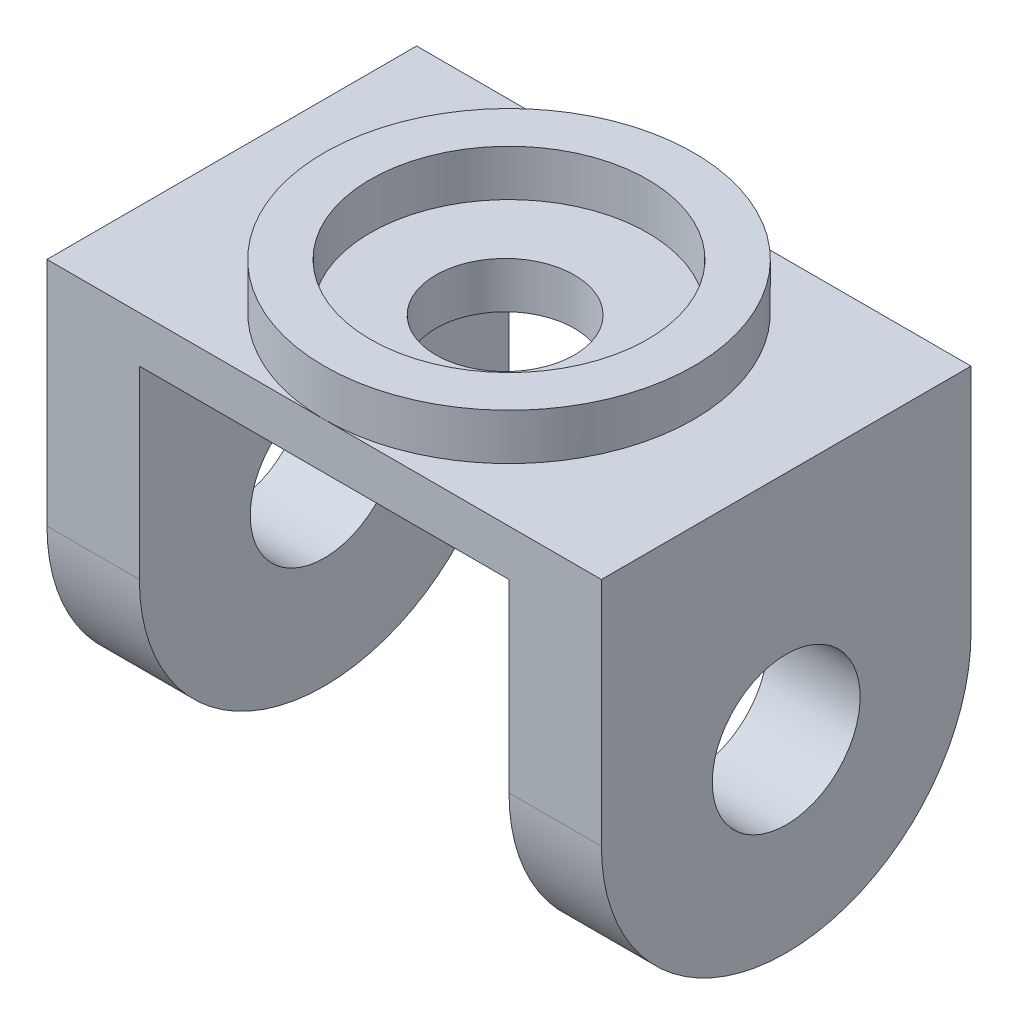
ISO-10303-21;
HEADER;
FILE_DESCRIPTION(('STEP AP214'),'2;1');
FILE_NAME('part.step','',(''),(''),'','','');
FILE_SCHEMA(('AUTOMOTIVE_DESIGN { 1 0 10303 214 1 1 1 1 }'));
ENDSEC;
DATA;
#1=APPLICATION_CONTEXT('core data for automotive mechanical design processes');
#2=APPLICATION_PROTOCOL_DEFINITION('international standard','automotive_design',2000,#1);
#3=PRODUCT_CONTEXT('',#1,'mechanical');
#4=PRODUCT('Part','Part','',(#3));
#5=PRODUCT_RELATED_PRODUCT_CATEGORY('part','',(#4));
#6=PRODUCT_DEFINITION_FORMATION('','',#4);
#7=PRODUCT_DEFINITION_CONTEXT('part definition',#1,'design');
#8=PRODUCT_DEFINITION('design','',#6,#7);
#9=PRODUCT_DEFINITION_SHAPE('','',#8);
#10=(LENGTH_UNIT() NAMED_UNIT(*) SI_UNIT(.MILLI.,.METRE.));
#11=(NAMED_UNIT(*) PLANE_ANGLE_UNIT() SI_UNIT($,.RADIAN.));
#12=(NAMED_UNIT(*) SI_UNIT($,.STERADIAN.) SOLID_ANGLE_UNIT());
#13=UNCERTAINTY_MEASURE_WITH_UNIT(LENGTH_MEASURE(1.E-05),#10,'distance_accuracy_value','');
#14=(GEOMETRIC_REPRESENTATION_CONTEXT(3) GLOBAL_UNCERTAINTY_ASSIGNED_CONTEXT((#13)) GLOBAL_UNIT_ASSIGNED_CONTEXT((#10,
#11,#12)) REPRESENTATION_CONTEXT('',''));
#15=CARTESIAN_POINT('',(0.,0.,0.));
#16=DIRECTION('',(0.,0.,1.));
#17=DIRECTION('',(1.,0.,0.));
#18=AXIS2_PLACEMENT_3D('',#15,#16,#17);
#19=CARTESIAN_POINT('',(60.,-40.,0.));
#20=DIRECTION('',(-1.,0.,0.));
#21=DIRECTION('',(0.,0.,1.));
#22=AXIS2_PLACEMENT_3D('',#19,#20,#21);
#23=CYLINDRICAL_SURFACE('',#22,40.);
#24=DIRECTION('',(1.,0.,0.));
#25=VECTOR('',#24,1.);
#26=CARTESIAN_POINT('',(60.,-40.,-40.));
#27=LINE('',#26,#25);
#28=CARTESIAN_POINT('',(60.,-40.,-40.));
#29=VERTEX_POINT('',#28);
#30=CARTESIAN_POINT('',(40.,-40.,-40.));
#31=VERTEX_POINT('',#30);
#32=EDGE_CURVE('E187',#29,#31,#27,.F.);
#33=ORIENTED_EDGE('',*,*,#32,.F.);
#34=CARTESIAN_POINT('',(60.,-40.,0.));
#35=DIRECTION('',(-1.,0.,0.));
#36=DIRECTION('',(0.,0.,1.));
#37=AXIS2_PLACEMENT_3D('',#34,#35,#36);
#38=CIRCLE('',#37,40.);
#39=CARTESIAN_POINT('',(60.,-40.,40.));
#40=VERTEX_POINT('',#39);
#41=EDGE_CURVE('E55',#40,#29,#38,.F.);
#42=ORIENTED_EDGE('',*,*,#41,.F.);
#43=DIRECTION('',(1.,0.,0.));
#44=VECTOR('',#43,1.);
#45=CARTESIAN_POINT('',(60.,-40.,40.));
#46=LINE('',#45,#44);
#47=CARTESIAN_POINT('',(40.,-40.,40.));
#48=VERTEX_POINT('',#47);
#49=EDGE_CURVE('E196',#48,#40,#46,.T.);
#50=ORIENTED_EDGE('',*,*,#49,.F.);
#51=CARTESIAN_POINT('',(40.,-40.,0.));
#52=DIRECTION('',(-1.,0.,0.));
#53=DIRECTION('',(0.,0.,1.));
#54=AXIS2_PLACEMENT_3D('',#51,#52,#53);
#55=CIRCLE('',#54,40.);
#56=EDGE_CURVE('E11',#31,#48,#55,.T.);
#57=ORIENTED_EDGE('',*,*,#56,.F.);
#58=EDGE_LOOP('',(#33,#42,#50,#57));
#59=FACE_BOUND('',#58,.T.);
#60=ADVANCED_FACE('F45',(#59),#23,.T.);
#61=CARTESIAN_POINT('',(-40.,-40.,0.));
#62=DIRECTION('',(1.,0.,0.));
#63=DIRECTION('',(0.,0.,-1.));
#64=AXIS2_PLACEMENT_3D('',#61,#62,#63);
#65=CYLINDRICAL_SURFACE('',#64,40.);
#66=DIRECTION('',(-1.,0.,0.));
#67=VECTOR('',#66,1.);
#68=CARTESIAN_POINT('',(-40.,-40.,-40.));
#69=LINE('',#68,#67);
#70=CARTESIAN_POINT('',(-40.,-40.,-40.));
#71=VERTEX_POINT('',#70);
#72=CARTESIAN_POINT('',(-60.,-40.,-40.));
#73=VERTEX_POINT('',#72);
#74=EDGE_CURVE('E174',#71,#73,#69,.T.);
#75=ORIENTED_EDGE('',*,*,#74,.F.);
#76=CARTESIAN_POINT('',(-40.,-40.,0.));
#77=DIRECTION('',(-1.,0.,0.));
#78=DIRECTION('',(0.,0.,1.));
#79=AXIS2_PLACEMENT_3D('',#76,#77,#78);
#80=CIRCLE('',#79,40.);
#81=CARTESIAN_POINT('',(-40.,-40.,40.));
#82=VERTEX_POINT('',#81);
#83=EDGE_CURVE('E181',#82,#71,#80,.F.);
#84=ORIENTED_EDGE('',*,*,#83,.F.);
#85=DIRECTION('',(-1.,0.,0.));
#86=VECTOR('',#85,1.);
#87=CARTESIAN_POINT('',(-40.,-40.,40.));
#88=LINE('',#87,#86);
#89=CARTESIAN_POINT('',(-60.,-40.,40.));
#90=VERTEX_POINT('',#89);
#91=EDGE_CURVE('E178',#90,#82,#88,.F.);
#92=ORIENTED_EDGE('',*,*,#91,.F.);
#93=CARTESIAN_POINT('',(-60.,-40.,0.));
#94=DIRECTION('',(1.,0.,0.));
#95=DIRECTION('',(0.,0.,-1.));
#96=AXIS2_PLACEMENT_3D('',#93,#94,#95);
#97=CIRCLE('',#96,40.);
#98=EDGE_CURVE('E184',#73,#90,#97,.F.);
#99=ORIENTED_EDGE('',*,*,#98,.F.);
#100=EDGE_LOOP('',(#75,#84,#92,#99));
#101=FACE_BOUND('',#100,.T.);
#102=ADVANCED_FACE('F275',(#101),#65,.T.);
#103=CARTESIAN_POINT('',(0.,0.,0.));
#104=DIRECTION('',(0.,1.,0.));
#105=DIRECTION('',(0.,0.,1.));
#106=AXIS2_PLACEMENT_3D('',#103,#104,#105);
#107=PLANE('',#106);
#108=CARTESIAN_POINT('',(0.,0.,0.840544131092552));
#109=DIRECTION('',(0.,1.,0.));
#110=DIRECTION('',(0.,0.,1.));
#111=AXIS2_PLACEMENT_3D('',#108,#109,#110);
#112=CIRCLE('',#111,15.);
#113=CARTESIAN_POINT('',(0.,0.,15.8405441310926));
#114=VERTEX_POINT('',#113);
#115=EDGE_CURVE('E168',#114,#114,#112,.T.);
#116=ORIENTED_EDGE('',*,*,#115,.T.);
#117=EDGE_LOOP('',(#116));
#118=FACE_BOUND('',#117,.T.);
#119=DIRECTION('',(-1.,0.,0.));
#120=VECTOR('',#119,1.);
#121=CARTESIAN_POINT('',(-60.,0.,-40.));
#122=LINE('',#121,#120);
#123=CARTESIAN_POINT('',(40.,0.,-40.));
#124=VERTEX_POINT('',#123);
#125=CARTESIAN_POINT('',(-40.,0.,-40.));
#126=VERTEX_POINT('',#125);
#127=EDGE_CURVE('E131',#124,#126,#122,.T.);
#128=ORIENTED_EDGE('',*,*,#127,.F.);
#129=DIRECTION('',(0.,0.,1.));
#130=VECTOR('',#129,1.);
#131=CARTESIAN_POINT('',(40.,0.,40.));
#132=LINE('',#131,#130);
#133=CARTESIAN_POINT('',(40.,0.,40.));
#134=VERTEX_POINT('',#133);
#135=EDGE_CURVE('E117',#124,#134,#132,.T.);
#136=ORIENTED_EDGE('',*,*,#135,.T.);
#137=DIRECTION('',(1.,0.,0.));
#138=VECTOR('',#137,1.);
#139=CARTESIAN_POINT('',(-60.,0.,40.));
#140=LINE('',#139,#138);
#141=CARTESIAN_POINT('',(-40.,0.,40.));
#142=VERTEX_POINT('',#141);
#143=EDGE_CURVE('E129',#142,#134,#140,.T.);
#144=ORIENTED_EDGE('',*,*,#143,.F.);
#145=DIRECTION('',(0.,0.,1.));
#146=VECTOR('',#145,1.);
#147=CARTESIAN_POINT('',(-40.,0.,40.));
#148=LINE('',#147,#146);
#149=EDGE_CURVE('E192',#126,#142,#148,.T.);
#150=ORIENTED_EDGE('',*,*,#149,.F.);
#151=EDGE_LOOP('',(#128,#136,#144,#150));
#152=FACE_BOUND('',#151,.T.);
#153=ADVANCED_FACE('F127',(#118,#152),#107,.F.);
#154=CARTESIAN_POINT('',(0.,10.,0.));
#155=DIRECTION('',(0.,1.,0.));
#156=DIRECTION('',(0.,0.,1.));
#157=AXIS2_PLACEMENT_3D('',#154,#155,#156);
#158=PLANE('',#157);
#159=DIRECTION('',(1.,0.,0.));
#160=VECTOR('',#159,1.);
#161=CARTESIAN_POINT('',(-60.,10.,40.));
#162=LINE('',#161,#160);
#163=CARTESIAN_POINT('',(-60.,10.,40.));
#164=VERTEX_POINT('',#163);
#165=CARTESIAN_POINT('',(0.,10.,40.));
#166=VERTEX_POINT('',#165);
#167=EDGE_CURVE('E155',#164,#166,#162,.T.);
#168=ORIENTED_EDGE('',*,*,#167,.T.);
#169=CARTESIAN_POINT('',(0.,10.,0.));
#170=DIRECTION('',(0.,1.,0.));
#171=DIRECTION('',(0.,0.,1.));
#172=AXIS2_PLACEMENT_3D('',#169,#170,#171);
#173=CIRCLE('',#172,40.);
#174=CARTESIAN_POINT('',(0.,10.,-40.));
#175=VERTEX_POINT('',#174);
#176=EDGE_CURVE('E146',#166,#175,#173,.F.);
#177=ORIENTED_EDGE('',*,*,#176,.T.);
#178=DIRECTION('',(-1.,0.,0.));
#179=VECTOR('',#178,1.);
#180=CARTESIAN_POINT('',(-60.,10.,-40.));
#181=LINE('',#180,#179);
#182=CARTESIAN_POINT('',(-60.,10.,-40.));
#183=VERTEX_POINT('',#182);
#184=EDGE_CURVE('E144',#175,#183,#181,.T.);
#185=ORIENTED_EDGE('',*,*,#184,.T.);
#186=DIRECTION('',(0.,0.,1.));
#187=VECTOR('',#186,1.);
#188=CARTESIAN_POINT('',(-60.,10.,-40.));
#189=LINE('',#188,#187);
#190=EDGE_CURVE('E214',#183,#164,#189,.T.);
#191=ORIENTED_EDGE('',*,*,#190,.T.);
#192=EDGE_LOOP('',(#168,#177,#185,#191));
#193=FACE_BOUND('',#192,.T.);
#194=ADVANCED_FACE('F283',(#193),#158,.T.);
#195=CARTESIAN_POINT('',(60.,10.,-40.));
#196=DIRECTION('',(-1.,0.,0.));
#197=DIRECTION('',(0.,0.,1.));
#198=AXIS2_PLACEMENT_3D('',#195,#196,#197);
#199=PLANE('',#198);
#200=CARTESIAN_POINT('',(60.,-40.,0.));
#201=DIRECTION('',(-1.,0.,0.));
#202=DIRECTION('',(0.,0.,1.));
#203=AXIS2_PLACEMENT_3D('',#200,#201,#202);
#204=CIRCLE('',#203,16.);
#205=CARTESIAN_POINT('',(60.,-40.,16.));
#206=VERTEX_POINT('',#205);
#207=EDGE_CURVE('E255',#206,#206,#204,.T.);
#208=ORIENTED_EDGE('',*,*,#207,.T.);
#209=EDGE_LOOP('',(#208));
#210=FACE_BOUND('',#209,.T.);
#211=DIRECTION('',(0.,-1.,0.));
#212=VECTOR('',#211,1.);
#213=CARTESIAN_POINT('',(60.,10.,40.));
#214=LINE('',#213,#212);
#215=CARTESIAN_POINT('',(60.,10.,40.));
#216=VERTEX_POINT('',#215);
#217=EDGE_CURVE('E150',#216,#40,#214,.T.);
#218=ORIENTED_EDGE('',*,*,#217,.T.);
#219=ORIENTED_EDGE('',*,*,#41,.T.);
#220=DIRECTION('',(0.,-1.,0.));
#221=VECTOR('',#220,1.);
#222=CARTESIAN_POINT('',(60.,10.,-40.));
#223=LINE('',#222,#221);
#224=CARTESIAN_POINT('',(60.,10.,-40.));
#225=VERTEX_POINT('',#224);
#226=EDGE_CURVE('E163',#225,#29,#223,.T.);
#227=ORIENTED_EDGE('',*,*,#226,.F.);
#228=DIRECTION('',(0.,0.,-1.));
#229=VECTOR('',#228,1.);
#230=CARTESIAN_POINT('',(60.,10.,-40.));
#231=LINE('',#230,#229);
#232=EDGE_CURVE('E139',#216,#225,#231,.T.);
#233=ORIENTED_EDGE('',*,*,#232,.F.);
#234=EDGE_LOOP('',(#218,#219,#227,#233));
#235=FACE_BOUND('',#234,.T.);
#236=ADVANCED_FACE('F202',(#210,#235),#199,.F.);
#237=CARTESIAN_POINT('',(-60.,10.,-40.));
#238=DIRECTION('',(0.,0.,1.));
#239=DIRECTION('',(1.,0.,0.));
#240=AXIS2_PLACEMENT_3D('',#237,#238,#239);
#241=PLANE('',#240);
#242=ORIENTED_EDGE('',*,*,#226,.T.);
#243=ORIENTED_EDGE('',*,*,#32,.T.);
#244=DIRECTION('',(0.,1.,0.));
#245=VECTOR('',#244,1.);
#246=CARTESIAN_POINT('',(40.,-80.,-40.));
#247=LINE('',#246,#245);
#248=EDGE_CURVE('E123',#31,#124,#247,.T.);
#249=ORIENTED_EDGE('',*,*,#248,.T.);
#250=ORIENTED_EDGE('',*,*,#127,.T.);
#251=DIRECTION('',(0.,1.,0.));
#252=VECTOR('',#251,1.);
#253=CARTESIAN_POINT('',(-40.,-80.,-40.));
#254=LINE('',#253,#252);
#255=EDGE_CURVE('E242',#71,#126,#254,.T.);
#256=ORIENTED_EDGE('',*,*,#255,.F.);
#257=ORIENTED_EDGE('',*,*,#74,.T.);
#258=DIRECTION('',(0.,-1.,0.));
#259=VECTOR('',#258,1.);
#260=CARTESIAN_POINT('',(-60.,10.,-40.));
#261=LINE('',#260,#259);
#262=EDGE_CURVE('E159',#183,#73,#261,.T.);
#263=ORIENTED_EDGE('',*,*,#262,.F.);
#264=ORIENTED_EDGE('',*,*,#184,.F.);
#265=EDGE_CURVE('E209',#225,#175,#181,.T.);
#266=ORIENTED_EDGE('',*,*,#265,.F.);
#267=EDGE_LOOP('',(#242,#243,#249,#250,#256,#257,#263,#264,#266));
#268=FACE_BOUND('',#267,.T.);
#269=ADVANCED_FACE('F206',(#268),#241,.F.);
#270=CARTESIAN_POINT('',(-60.,10.,-40.));
#271=DIRECTION('',(1.,0.,0.));
#272=DIRECTION('',(0.,0.,-1.));
#273=AXIS2_PLACEMENT_3D('',#270,#271,#272);
#274=PLANE('',#273);
#275=CARTESIAN_POINT('',(-60.,-40.,0.));
#276=DIRECTION('',(-1.,0.,0.));
#277=DIRECTION('',(0.,0.,1.));
#278=AXIS2_PLACEMENT_3D('',#275,#276,#277);
#279=CIRCLE('',#278,16.);
#280=CARTESIAN_POINT('',(-60.,-40.,16.));
#281=VERTEX_POINT('',#280);
#282=EDGE_CURVE('E122',#281,#281,#279,.T.);
#283=ORIENTED_EDGE('',*,*,#282,.F.);
#284=EDGE_LOOP('',(#283));
#285=FACE_BOUND('',#284,.T.);
#286=ORIENTED_EDGE('',*,*,#262,.T.);
#287=ORIENTED_EDGE('',*,*,#98,.T.);
#288=DIRECTION('',(0.,-1.,0.));
#289=VECTOR('',#288,1.);
#290=CARTESIAN_POINT('',(-60.,10.,40.));
#291=LINE('',#290,#289);
#292=EDGE_CURVE('E154',#164,#90,#291,.T.);
#293=ORIENTED_EDGE('',*,*,#292,.F.);
#294=ORIENTED_EDGE('',*,*,#190,.F.);
#295=EDGE_LOOP('',(#286,#287,#293,#294));
#296=FACE_BOUND('',#295,.T.);
#297=ADVANCED_FACE('F295',(#285,#296),#274,.F.);
#298=CARTESIAN_POINT('',(-60.,10.,40.));
#299=DIRECTION('',(0.,0.,-1.));
#300=DIRECTION('',(-1.,0.,0.));
#301=AXIS2_PLACEMENT_3D('',#298,#299,#300);
#302=PLANE('',#301);
#303=DIRECTION('',(0.,1.,0.));
#304=VECTOR('',#303,1.);
#305=CARTESIAN_POINT('',(40.,-80.,40.));
#306=LINE('',#305,#304);
#307=EDGE_CURVE('E114',#48,#134,#306,.T.);
#308=ORIENTED_EDGE('',*,*,#307,.F.);
#309=ORIENTED_EDGE('',*,*,#49,.T.);
#310=ORIENTED_EDGE('',*,*,#217,.F.);
#311=EDGE_CURVE('E218',#166,#216,#162,.T.);
#312=ORIENTED_EDGE('',*,*,#311,.F.);
#313=ORIENTED_EDGE('',*,*,#167,.F.);
#314=ORIENTED_EDGE('',*,*,#292,.T.);
#315=ORIENTED_EDGE('',*,*,#91,.T.);
#316=DIRECTION('',(0.,1.,0.));
#317=VECTOR('',#316,1.);
#318=CARTESIAN_POINT('',(-40.,-80.,40.));
#319=LINE('',#318,#317);
#320=EDGE_CURVE('E137',#82,#142,#319,.T.);
#321=ORIENTED_EDGE('',*,*,#320,.T.);
#322=ORIENTED_EDGE('',*,*,#143,.T.);
#323=EDGE_LOOP('',(#308,#309,#310,#312,#313,#314,#315,#321,#322));
#324=FACE_BOUND('',#323,.T.);
#325=ADVANCED_FACE('F134',(#324),#302,.F.);
#326=ORIENTED_EDGE('',*,*,#265,.T.);
#327=EDGE_CURVE('E219',#175,#166,#173,.F.);
#328=ORIENTED_EDGE('',*,*,#327,.T.);
#329=ORIENTED_EDGE('',*,*,#311,.T.);
#330=ORIENTED_EDGE('',*,*,#232,.T.);
#331=EDGE_LOOP('',(#326,#328,#329,#330));
#332=FACE_BOUND('',#331,.T.);
#333=ADVANCED_FACE('F216',(#332),#158,.T.);
#334=CARTESIAN_POINT('',(0.,20.,0.));
#335=DIRECTION('',(0.,1.,0.));
#336=DIRECTION('',(0.,0.,1.));
#337=AXIS2_PLACEMENT_3D('',#334,#335,#336);
#338=PLANE('',#337);
#339=CARTESIAN_POINT('',(0.,20.,0.));
#340=DIRECTION('',(0.,1.,0.));
#341=DIRECTION('',(0.,0.,1.));
#342=AXIS2_PLACEMENT_3D('',#339,#340,#341);
#343=CIRCLE('',#342,40.);
#344=CARTESIAN_POINT('',(0.,20.,40.));
#345=VERTEX_POINT('',#344);
#346=EDGE_CURVE('E229',#345,#345,#343,.T.);
#347=ORIENTED_EDGE('',*,*,#346,.T.);
#348=EDGE_LOOP('',(#347));
#349=FACE_BOUND('',#348,.T.);
#350=CARTESIAN_POINT('',(0.,20.,0.));
#351=DIRECTION('',(0.,1.,0.));
#352=DIRECTION('',(0.,0.,1.));
#353=AXIS2_PLACEMENT_3D('',#350,#351,#352);
#354=CIRCLE('',#353,30.);
#355=CARTESIAN_POINT('',(0.,20.,30.));
#356=VERTEX_POINT('',#355);
#357=EDGE_CURVE('E172',#356,#356,#354,.T.);
#358=ORIENTED_EDGE('',*,*,#357,.F.);
#359=EDGE_LOOP('',(#358));
#360=FACE_BOUND('',#359,.T.);
#361=ADVANCED_FACE('F303',(#349,#360),#338,.T.);
#362=CARTESIAN_POINT('',(0.,20.,0.));
#363=DIRECTION('',(0.,-1.,0.));
#364=DIRECTION('',(0.,0.,-1.));
#365=AXIS2_PLACEMENT_3D('',#362,#363,#364);
#366=CYLINDRICAL_SURFACE('',#365,40.);
#367=ORIENTED_EDGE('',*,*,#176,.F.);
#368=ORIENTED_EDGE('',*,*,#327,.F.);
#369=EDGE_LOOP('',(#367,#368));
#370=FACE_BOUND('',#369,.T.);
#371=ORIENTED_EDGE('',*,*,#346,.F.);
#372=EDGE_LOOP('',(#371));
#373=FACE_BOUND('',#372,.T.);
#374=ADVANCED_FACE('F305',(#370,#373),#366,.T.);
#375=CARTESIAN_POINT('',(0.,20.,0.));
#376=DIRECTION('',(0.,-1.,0.));
#377=DIRECTION('',(0.,0.,-1.));
#378=AXIS2_PLACEMENT_3D('',#375,#376,#377);
#379=CYLINDRICAL_SURFACE('',#378,30.);
#380=CARTESIAN_POINT('',(0.,10.,0.));
#381=DIRECTION('',(0.,1.,0.));
#382=DIRECTION('',(0.,0.,1.));
#383=AXIS2_PLACEMENT_3D('',#380,#381,#382);
#384=CIRCLE('',#383,30.);
#385=CARTESIAN_POINT('',(0.,10.,30.));
#386=VERTEX_POINT('',#385);
#387=EDGE_CURVE('E167',#386,#386,#384,.F.);
#388=ORIENTED_EDGE('',*,*,#387,.T.);
#389=EDGE_LOOP('',(#388));
#390=FACE_BOUND('',#389,.T.);
#391=ORIENTED_EDGE('',*,*,#357,.T.);
#392=EDGE_LOOP('',(#391));
#393=FACE_BOUND('',#392,.T.);
#394=ADVANCED_FACE('F308',(#390,#393),#379,.F.);
#395=CARTESIAN_POINT('',(0.,10.,0.840544131092552));
#396=DIRECTION('',(0.,1.,0.));
#397=DIRECTION('',(0.,0.,1.));
#398=AXIS2_PLACEMENT_3D('',#395,#396,#397);
#399=CIRCLE('',#398,15.);
#400=CARTESIAN_POINT('',(0.,10.,15.8405441310926));
#401=VERTEX_POINT('',#400);
#402=EDGE_CURVE('E173',#401,#401,#399,.T.);
#403=ORIENTED_EDGE('',*,*,#402,.F.);
#404=EDGE_LOOP('',(#403));
#405=FACE_BOUND('',#404,.T.);
#406=ORIENTED_EDGE('',*,*,#387,.F.);
#407=EDGE_LOOP('',(#406));
#408=FACE_BOUND('',#407,.T.);
#409=ADVANCED_FACE('F304',(#405,#408),#158,.T.);
#410=CARTESIAN_POINT('',(0.,-10.,0.840544131092552));
#411=DIRECTION('',(0.,1.,0.));
#412=DIRECTION('',(0.,0.,1.));
#413=AXIS2_PLACEMENT_3D('',#410,#411,#412);
#414=CYLINDRICAL_SURFACE('',#413,15.);
#415=ORIENTED_EDGE('',*,*,#402,.T.);
#416=EDGE_LOOP('',(#415));
#417=FACE_BOUND('',#416,.T.);
#418=ORIENTED_EDGE('',*,*,#115,.F.);
#419=EDGE_LOOP('',(#418));
#420=FACE_BOUND('',#419,.T.);
#421=ADVANCED_FACE('F316',(#417,#420),#414,.F.);
#422=CARTESIAN_POINT('',(-40.,-80.,40.));
#423=DIRECTION('',(-1.,0.,0.));
#424=DIRECTION('',(0.,0.,1.));
#425=AXIS2_PLACEMENT_3D('',#422,#423,#424);
#426=PLANE('',#425);
#427=CARTESIAN_POINT('',(-40.,-40.,0.));
#428=DIRECTION('',(-1.,0.,0.));
#429=DIRECTION('',(0.,0.,1.));
#430=AXIS2_PLACEMENT_3D('',#427,#428,#429);
#431=CIRCLE('',#430,16.);
#432=CARTESIAN_POINT('',(-40.,-40.,16.));
#433=VERTEX_POINT('',#432);
#434=EDGE_CURVE('E188',#433,#433,#431,.T.);
#435=ORIENTED_EDGE('',*,*,#434,.T.);
#436=EDGE_LOOP('',(#435));
#437=FACE_BOUND('',#436,.T.);
#438=ORIENTED_EDGE('',*,*,#320,.F.);
#439=ORIENTED_EDGE('',*,*,#83,.T.);
#440=ORIENTED_EDGE('',*,*,#255,.T.);
#441=ORIENTED_EDGE('',*,*,#149,.T.);
#442=EDGE_LOOP('',(#438,#439,#440,#441));
#443=FACE_BOUND('',#442,.T.);
#444=ADVANCED_FACE('F319',(#437,#443),#426,.F.);
#445=CARTESIAN_POINT('',(60.,-40.,0.));
#446=DIRECTION('',(-1.,0.,0.));
#447=DIRECTION('',(0.,0.,1.));
#448=AXIS2_PLACEMENT_3D('',#445,#446,#447);
#449=CYLINDRICAL_SURFACE('',#448,16.);
#450=CARTESIAN_POINT('',(-60.,-40.,16.));
#451=CARTESIAN_POINT('',(-59.7916666666667,-40.,16.));
#452=CARTESIAN_POINT('',(-59.5833333333333,-40.,16.));
#453=CARTESIAN_POINT('',(-59.1666666666667,-40.,16.));
#454=CARTESIAN_POINT('',(-58.9583333333333,-40.,16.));
#455=CARTESIAN_POINT('',(-58.5416666666667,-40.,16.));
#456=CARTESIAN_POINT('',(-58.3333333333333,-40.,16.));
#457=CARTESIAN_POINT('',(-57.9166666666667,-40.,16.));
#458=CARTESIAN_POINT('',(-57.7083333333333,-40.,16.));
#459=CARTESIAN_POINT('',(-57.2916666666667,-40.,16.));
#460=CARTESIAN_POINT('',(-57.0833333333333,-40.,16.));
#461=CARTESIAN_POINT('',(-56.6666666666667,-40.,16.));
#462=CARTESIAN_POINT('',(-56.4583333333333,-40.,16.));
#463=CARTESIAN_POINT('',(-56.0416666666667,-40.,16.));
#464=CARTESIAN_POINT('',(-55.8333333333333,-40.,16.));
#465=CARTESIAN_POINT('',(-55.4166666666667,-40.,16.));
#466=CARTESIAN_POINT('',(-55.2083333333333,-40.,16.));
#467=CARTESIAN_POINT('',(-54.7916666666667,-40.,16.));
#468=CARTESIAN_POINT('',(-54.5833333333333,-40.,16.));
#469=CARTESIAN_POINT('',(-54.1666666666667,-40.,16.));
#470=CARTESIAN_POINT('',(-53.9583333333333,-40.,16.));
#471=CARTESIAN_POINT('',(-53.5416666666667,-40.,16.));
#472=CARTESIAN_POINT('',(-53.3333333333333,-40.,16.));
#473=CARTESIAN_POINT('',(-52.9166666666667,-40.,16.));
#474=CARTESIAN_POINT('',(-52.7083333333333,-40.,16.));
#475=CARTESIAN_POINT('',(-52.2916666666667,-40.,16.));
#476=CARTESIAN_POINT('',(-52.0833333333333,-40.,16.));
#477=CARTESIAN_POINT('',(-51.6666666666667,-40.,16.));
#478=CARTESIAN_POINT('',(-51.4583333333333,-40.,16.));
#479=CARTESIAN_POINT('',(-51.0416666666667,-40.,16.));
#480=CARTESIAN_POINT('',(-50.8333333333333,-40.,16.));
#481=CARTESIAN_POINT('',(-50.4166666666667,-40.,16.));
#482=CARTESIAN_POINT('',(-50.2083333333333,-40.,16.));
#483=CARTESIAN_POINT('',(-49.7916666666667,-40.,16.));
#484=CARTESIAN_POINT('',(-49.5833333333333,-40.,16.));
#485=CARTESIAN_POINT('',(-49.1666666666667,-40.,16.));
#486=CARTESIAN_POINT('',(-48.9583333333333,-40.,16.));
#487=CARTESIAN_POINT('',(-48.5416666666667,-40.,16.));
#488=CARTESIAN_POINT('',(-48.3333333333333,-40.,16.));
#489=CARTESIAN_POINT('',(-47.9166666666667,-40.,16.));
#490=CARTESIAN_POINT('',(-47.7083333333333,-40.,16.));
#491=CARTESIAN_POINT('',(-47.2916666666667,-40.,16.));
#492=CARTESIAN_POINT('',(-47.0833333333333,-40.,16.));
#493=CARTESIAN_POINT('',(-46.6666666666667,-40.,16.));
#494=CARTESIAN_POINT('',(-46.4583333333333,-40.,16.));
#495=CARTESIAN_POINT('',(-46.0416666666667,-40.,16.));
#496=CARTESIAN_POINT('',(-45.8333333333333,-40.,16.));
#497=CARTESIAN_POINT('',(-45.4166666666667,-40.,16.));
#498=CARTESIAN_POINT('',(-45.2083333333333,-40.,16.));
#499=CARTESIAN_POINT('',(-44.7916666666667,-40.,16.));
#500=CARTESIAN_POINT('',(-44.5833333333333,-40.,16.));
#501=CARTESIAN_POINT('',(-44.1666666666667,-40.,16.));
#502=CARTESIAN_POINT('',(-43.9583333333333,-40.,16.));
#503=CARTESIAN_POINT('',(-43.5416666666667,-40.,16.));
#504=CARTESIAN_POINT('',(-43.3333333333333,-40.,16.));
#505=CARTESIAN_POINT('',(-42.9166666666667,-40.,16.));
#506=CARTESIAN_POINT('',(-42.7083333333333,-40.,16.));
#507=CARTESIAN_POINT('',(-42.2916666666667,-40.,16.));
#508=CARTESIAN_POINT('',(-42.0833333333333,-40.,16.));
#509=CARTESIAN_POINT('',(-41.6666666666667,-40.,16.));
#510=CARTESIAN_POINT('',(-41.4583333333333,-40.,16.));
#511=CARTESIAN_POINT('',(-41.0416666666667,-40.,16.));
#512=CARTESIAN_POINT('',(-40.8333333333333,-40.,16.));
#513=CARTESIAN_POINT('',(-40.4166666666667,-40.,16.));
#514=CARTESIAN_POINT('',(-40.2083333333333,-40.,16.));
#515=CARTESIAN_POINT('',(-40.,-40.,16.));
#516=B_SPLINE_CURVE_WITH_KNOTS('',3,(#450,#451,#452,#453,#454,#455,#456,#457,#458,#459,#460,
#461,#462,#463,#464,#465,#466,#467,#468,#469,#470,#471,#472,#473,#474,#475,#476,#477,#478,#479,
#480,#481,#482,#483,#484,#485,#486,#487,#488,#489,#490,#491,#492,#493,#494,#495,#496,#497,#498,
#499,#500,#501,#502,#503,#504,#505,#506,#507,#508,#509,#510,#511,#512,#513,#514,#515),
.UNSPECIFIED.,.F.,.F.,(4,2,2,2,2,2,2,2,2,2,2,2,2,2,2,2,2,2,2,2,2,2,2,2,2,2,2,2,2,2,2,2,4),(0.,
0.625000000000001,1.25,1.875,2.5,3.125,3.75,4.375,5.,5.62500000000001,6.25000000000001,
6.87500000000001,7.50000000000001,8.12500000000001,8.75000000000001,9.37500000000001,10.,10.625,
11.25,11.875,12.5,13.125,13.75,14.375,15.,15.625,16.25,16.875,17.5,18.125,18.75,19.375,20.),.UNSPECIFIED.);
#517=EDGE_CURVE('BSEAM272',#281,#433,#516,.T.);
#518=ORIENTED_EDGE('',*,*,#282,.T.);
#519=ORIENTED_EDGE('',*,*,#434,.F.);
#520=ORIENTED_EDGE('',*,*,#517,.T.);
#521=ORIENTED_EDGE('',*,*,#517,.F.);
#522=EDGE_LOOP('',(#518,#520,#519,#521));
#523=FACE_BOUND('',#522,.T.);
#524=ADVANCED_FACE('F272',(#523),#449,.F.);
#525=CARTESIAN_POINT('',(40.,-80.,40.));
#526=DIRECTION('',(-1.,0.,0.));
#527=DIRECTION('',(0.,0.,1.));
#528=AXIS2_PLACEMENT_3D('',#525,#526,#527);
#529=PLANE('',#528);
#530=CARTESIAN_POINT('',(40.,-40.,0.));
#531=DIRECTION('',(-1.,0.,0.));
#532=DIRECTION('',(0.,0.,1.));
#533=AXIS2_PLACEMENT_3D('',#530,#531,#532);
#534=CIRCLE('',#533,16.);
#535=CARTESIAN_POINT('',(40.,-40.,16.));
#536=VERTEX_POINT('',#535);
#537=EDGE_CURVE('E49',#536,#536,#534,.F.);
#538=ORIENTED_EDGE('',*,*,#537,.T.);
#539=EDGE_LOOP('',(#538));
#540=FACE_BOUND('',#539,.T.);
#541=ORIENTED_EDGE('',*,*,#248,.F.);
#542=ORIENTED_EDGE('',*,*,#56,.T.);
#543=ORIENTED_EDGE('',*,*,#307,.T.);
#544=ORIENTED_EDGE('',*,*,#135,.F.);
#545=EDGE_LOOP('',(#541,#542,#543,#544));
#546=FACE_BOUND('',#545,.T.);
#547=ADVANCED_FACE('F116',(#540,#546),#529,.T.);
#548=CARTESIAN_POINT('',(-60.,-40.,0.));
#549=DIRECTION('',(1.,0.,0.));
#550=DIRECTION('',(0.,0.,-1.));
#551=AXIS2_PLACEMENT_3D('',#548,#549,#550);
#552=CYLINDRICAL_SURFACE('',#551,16.);
#553=ORIENTED_EDGE('',*,*,#537,.F.);
#554=EDGE_LOOP('',(#553));
#555=FACE_BOUND('',#554,.T.);
#556=ORIENTED_EDGE('',*,*,#207,.F.);
#557=EDGE_LOOP('',(#556));
#558=FACE_BOUND('',#557,.T.);
#559=ADVANCED_FACE('F265',(#555,#558),#552,.F.);
#560=CLOSED_SHELL('',(#60,#102,#153,#194,#236,#269,#297,#325,#333,#361,#374,#394,#409,#421,#444,
#524,#547,#559));
#561=MANIFOLD_SOLID_BREP('B2',#560);
#562=ADVANCED_BREP_SHAPE_REPRESENTATION('',(#18,#561),#14);
#563=SHAPE_DEFINITION_REPRESENTATION(#9,#562);
ENDSEC;
END-ISO-10303-21;
